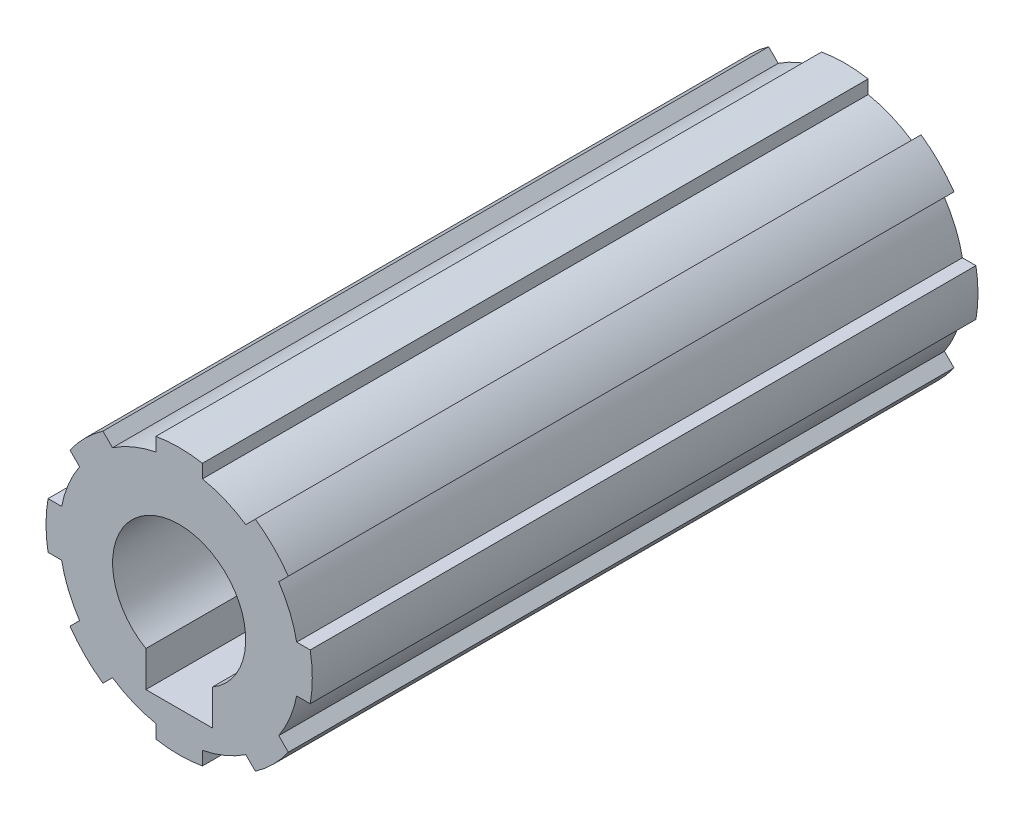
ISO-10303-21;
HEADER;
FILE_DESCRIPTION(('STEP AP214'),'2;1');
FILE_NAME('part.step','',(''),(''),'','','');
FILE_SCHEMA(('AUTOMOTIVE_DESIGN { 1 0 10303 214 1 1 1 1 }'));
ENDSEC;
DATA;
#1=APPLICATION_CONTEXT('core data for automotive mechanical design processes');
#2=APPLICATION_PROTOCOL_DEFINITION('international standard','automotive_design',2000,#1);
#3=PRODUCT_CONTEXT('',#1,'mechanical');
#4=PRODUCT('Part','Part','',(#3));
#5=PRODUCT_RELATED_PRODUCT_CATEGORY('part','',(#4));
#6=PRODUCT_DEFINITION_FORMATION('','',#4);
#7=PRODUCT_DEFINITION_CONTEXT('part definition',#1,'design');
#8=PRODUCT_DEFINITION('design','',#6,#7);
#9=PRODUCT_DEFINITION_SHAPE('','',#8);
#10=(LENGTH_UNIT() NAMED_UNIT(*) SI_UNIT(.MILLI.,.METRE.));
#11=(NAMED_UNIT(*) PLANE_ANGLE_UNIT() SI_UNIT($,.RADIAN.));
#12=(NAMED_UNIT(*) SI_UNIT($,.STERADIAN.) SOLID_ANGLE_UNIT());
#13=UNCERTAINTY_MEASURE_WITH_UNIT(LENGTH_MEASURE(1.E-05),#10,'distance_accuracy_value','');
#14=(GEOMETRIC_REPRESENTATION_CONTEXT(3) GLOBAL_UNCERTAINTY_ASSIGNED_CONTEXT((#13)) GLOBAL_UNIT_ASSIGNED_CONTEXT((#10,
#11,#12)) REPRESENTATION_CONTEXT('',''));
#15=CARTESIAN_POINT('',(0.,0.,0.));
#16=DIRECTION('',(0.,0.,1.));
#17=DIRECTION('',(1.,0.,0.));
#18=AXIS2_PLACEMENT_3D('',#15,#16,#17);
#19=CARTESIAN_POINT('',(0.,0.,50.));
#20=DIRECTION('',(0.,0.,-1.));
#21=DIRECTION('',(-1.,0.,0.));
#22=AXIS2_PLACEMENT_3D('',#19,#20,#21);
#23=CYLINDRICAL_SURFACE('',#22,18.);
#24=DIRECTION('',(0.,0.,-1.));
#25=VECTOR('',#24,1.);
#26=CARTESIAN_POINT('',(10.0101172550309,14.9598647233367,50.));
#27=LINE('',#26,#25);
#28=CARTESIAN_POINT('',(10.0101172550309,14.9598647233367,-50.));
#29=VERTEX_POINT('',#28);
#30=CARTESIAN_POINT('',(10.0101172550309,14.9598647233367,50.));
#31=VERTEX_POINT('',#30);
#32=EDGE_CURVE('E496',#29,#31,#27,.F.);
#33=ORIENTED_EDGE('',*,*,#32,.F.);
#34=CARTESIAN_POINT('',(0.,0.,-50.));
#35=DIRECTION('',(0.,0.,1.));
#36=DIRECTION('',(1.,0.,0.));
#37=AXIS2_PLACEMENT_3D('',#34,#35,#36);
#38=CIRCLE('',#37,18.);
#39=CARTESIAN_POINT('',(3.5,17.6564435830096,-50.));
#40=VERTEX_POINT('',#39);
#41=EDGE_CURVE('E525',#29,#40,#38,.T.);
#42=ORIENTED_EDGE('',*,*,#41,.T.);
#43=DIRECTION('',(0.,0.,-1.));
#44=VECTOR('',#43,1.);
#45=CARTESIAN_POINT('',(3.5,17.6564435830096,50.));
#46=LINE('',#45,#44);
#47=CARTESIAN_POINT('',(3.5,17.6564435830096,50.));
#48=VERTEX_POINT('',#47);
#49=EDGE_CURVE('E520',#48,#40,#46,.T.);
#50=ORIENTED_EDGE('',*,*,#49,.F.);
#51=CARTESIAN_POINT('',(0.,0.,50.));
#52=DIRECTION('',(0.,0.,1.));
#53=DIRECTION('',(1.,0.,0.));
#54=AXIS2_PLACEMENT_3D('',#51,#52,#53);
#55=CIRCLE('',#54,18.);
#56=EDGE_CURVE('E42',#31,#48,#55,.T.);
#57=ORIENTED_EDGE('',*,*,#56,.F.);
#58=EDGE_LOOP('',(#33,#42,#50,#57));
#59=FACE_BOUND('',#58,.T.);
#60=ADVANCED_FACE('F33',(#59),#23,.T.);
#61=DIRECTION('',(0.,0.,-1.));
#62=VECTOR('',#61,1.);
#63=CARTESIAN_POINT('',(14.9598647233367,10.0101172550308,50.));
#64=LINE('',#63,#62);
#65=CARTESIAN_POINT('',(14.9598647233367,10.0101172550308,50.));
#66=VERTEX_POINT('',#65);
#67=CARTESIAN_POINT('',(14.9598647233367,10.0101172550308,-50.));
#68=VERTEX_POINT('',#67);
#69=EDGE_CURVE('E493',#66,#68,#64,.T.);
#70=ORIENTED_EDGE('',*,*,#69,.F.);
#71=CARTESIAN_POINT('',(17.6564435830096,3.49999999999994,50.));
#72=VERTEX_POINT('',#71);
#73=EDGE_CURVE('E532',#72,#66,#55,.T.);
#74=ORIENTED_EDGE('',*,*,#73,.F.);
#75=DIRECTION('',(0.,0.,-1.));
#76=VECTOR('',#75,1.);
#77=CARTESIAN_POINT('',(17.6564435830096,3.49999999999994,50.));
#78=LINE('',#77,#76);
#79=CARTESIAN_POINT('',(17.6564435830096,3.49999999999994,-50.));
#80=VERTEX_POINT('',#79);
#81=EDGE_CURVE('E490',#80,#72,#78,.F.);
#82=ORIENTED_EDGE('',*,*,#81,.F.);
#83=EDGE_CURVE('E528',#80,#68,#38,.T.);
#84=ORIENTED_EDGE('',*,*,#83,.T.);
#85=EDGE_LOOP('',(#70,#74,#82,#84));
#86=FACE_BOUND('',#85,.T.);
#87=ADVANCED_FACE('F580',(#86),#23,.T.);
#88=DIRECTION('',(0.,0.,-1.));
#89=VECTOR('',#88,1.);
#90=CARTESIAN_POINT('',(-10.0101172550308,14.9598647233367,50.));
#91=LINE('',#90,#89);
#92=CARTESIAN_POINT('',(-10.0101172550308,14.9598647233367,50.));
#93=VERTEX_POINT('',#92);
#94=CARTESIAN_POINT('',(-10.0101172550308,14.9598647233367,-50.));
#95=VERTEX_POINT('',#94);
#96=EDGE_CURVE('E487',#93,#95,#91,.T.);
#97=ORIENTED_EDGE('',*,*,#96,.F.);
#98=CARTESIAN_POINT('',(-3.5,17.6564435830096,50.));
#99=VERTEX_POINT('',#98);
#100=EDGE_CURVE('E11',#99,#93,#55,.T.);
#101=ORIENTED_EDGE('',*,*,#100,.F.);
#102=DIRECTION('',(0.,0.,-1.));
#103=VECTOR('',#102,1.);
#104=CARTESIAN_POINT('',(-3.5,17.6564435830096,50.));
#105=LINE('',#104,#103);
#106=CARTESIAN_POINT('',(-3.5,17.6564435830096,-50.));
#107=VERTEX_POINT('',#106);
#108=EDGE_CURVE('E523',#107,#99,#105,.F.);
#109=ORIENTED_EDGE('',*,*,#108,.F.);
#110=EDGE_CURVE('E36',#107,#95,#38,.T.);
#111=ORIENTED_EDGE('',*,*,#110,.T.);
#112=EDGE_LOOP('',(#97,#101,#109,#111));
#113=FACE_BOUND('',#112,.T.);
#114=ADVANCED_FACE('F585',(#113),#23,.T.);
#115=DIRECTION('',(0.,0.,-1.));
#116=VECTOR('',#115,1.);
#117=CARTESIAN_POINT('',(17.6564435830096,-3.50000000000006,50.));
#118=LINE('',#117,#116);
#119=CARTESIAN_POINT('',(17.6564435830096,-3.50000000000006,50.));
#120=VERTEX_POINT('',#119);
#121=CARTESIAN_POINT('',(17.6564435830096,-3.50000000000006,-50.));
#122=VERTEX_POINT('',#121);
#123=EDGE_CURVE('E484',#120,#122,#118,.T.);
#124=ORIENTED_EDGE('',*,*,#123,.F.);
#125=CARTESIAN_POINT('',(14.9598647233366,-10.0101172550309,50.));
#126=VERTEX_POINT('',#125);
#127=EDGE_CURVE('E562',#126,#120,#55,.T.);
#128=ORIENTED_EDGE('',*,*,#127,.F.);
#129=DIRECTION('',(0.,0.,-1.));
#130=VECTOR('',#129,1.);
#131=CARTESIAN_POINT('',(14.9598647233366,-10.0101172550309,50.));
#132=LINE('',#131,#130);
#133=CARTESIAN_POINT('',(14.9598647233366,-10.0101172550309,-50.));
#134=VERTEX_POINT('',#133);
#135=EDGE_CURVE('E481',#134,#126,#132,.F.);
#136=ORIENTED_EDGE('',*,*,#135,.F.);
#137=EDGE_CURVE('E529',#134,#122,#38,.T.);
#138=ORIENTED_EDGE('',*,*,#137,.T.);
#139=EDGE_LOOP('',(#124,#128,#136,#138));
#140=FACE_BOUND('',#139,.T.);
#141=ADVANCED_FACE('F546',(#140),#23,.T.);
#142=DIRECTION('',(0.,0.,-1.));
#143=VECTOR('',#142,1.);
#144=CARTESIAN_POINT('',(10.0101172550308,-14.9598647233367,50.));
#145=LINE('',#144,#143);
#146=CARTESIAN_POINT('',(10.0101172550308,-14.9598647233367,50.));
#147=VERTEX_POINT('',#146);
#148=CARTESIAN_POINT('',(10.0101172550308,-14.9598647233367,-50.));
#149=VERTEX_POINT('',#148);
#150=EDGE_CURVE('E478',#147,#149,#145,.T.);
#151=ORIENTED_EDGE('',*,*,#150,.F.);
#152=CARTESIAN_POINT('',(3.49999999999988,-17.6564435830096,50.));
#153=VERTEX_POINT('',#152);
#154=EDGE_CURVE('E563',#153,#147,#55,.T.);
#155=ORIENTED_EDGE('',*,*,#154,.F.);
#156=DIRECTION('',(0.,0.,-1.));
#157=VECTOR('',#156,1.);
#158=CARTESIAN_POINT('',(3.49999999999988,-17.6564435830096,50.));
#159=LINE('',#158,#157);
#160=CARTESIAN_POINT('',(3.49999999999988,-17.6564435830096,-50.));
#161=VERTEX_POINT('',#160);
#162=EDGE_CURVE('E475',#161,#153,#159,.F.);
#163=ORIENTED_EDGE('',*,*,#162,.F.);
#164=EDGE_CURVE('E539',#161,#149,#38,.T.);
#165=ORIENTED_EDGE('',*,*,#164,.T.);
#166=EDGE_LOOP('',(#151,#155,#163,#165));
#167=FACE_BOUND('',#166,.T.);
#168=ADVANCED_FACE('F636',(#167),#23,.T.);
#169=DIRECTION('',(0.,0.,-1.));
#170=VECTOR('',#169,1.);
#171=CARTESIAN_POINT('',(-3.50000000000012,-17.6564435830096,50.));
#172=LINE('',#171,#170);
#173=CARTESIAN_POINT('',(-3.50000000000012,-17.6564435830096,50.));
#174=VERTEX_POINT('',#173);
#175=CARTESIAN_POINT('',(-3.50000000000012,-17.6564435830096,-50.));
#176=VERTEX_POINT('',#175);
#177=EDGE_CURVE('E472',#174,#176,#172,.T.);
#178=ORIENTED_EDGE('',*,*,#177,.F.);
#179=CARTESIAN_POINT('',(-10.010117255031,-14.9598647233366,50.));
#180=VERTEX_POINT('',#179);
#181=EDGE_CURVE('E565',#180,#174,#55,.T.);
#182=ORIENTED_EDGE('',*,*,#181,.F.);
#183=DIRECTION('',(0.,0.,-1.));
#184=VECTOR('',#183,1.);
#185=CARTESIAN_POINT('',(-10.010117255031,-14.9598647233366,50.));
#186=LINE('',#185,#184);
#187=CARTESIAN_POINT('',(-10.010117255031,-14.9598647233366,-50.));
#188=VERTEX_POINT('',#187);
#189=EDGE_CURVE('E469',#188,#180,#186,.F.);
#190=ORIENTED_EDGE('',*,*,#189,.F.);
#191=EDGE_CURVE('E536',#188,#176,#38,.T.);
#192=ORIENTED_EDGE('',*,*,#191,.T.);
#193=EDGE_LOOP('',(#178,#182,#190,#192));
#194=FACE_BOUND('',#193,.T.);
#195=ADVANCED_FACE('F594',(#194),#23,.T.);
#196=DIRECTION('',(0.,0.,-1.));
#197=VECTOR('',#196,1.);
#198=CARTESIAN_POINT('',(-14.9598647233368,-10.0101172550307,50.));
#199=LINE('',#198,#197);
#200=CARTESIAN_POINT('',(-14.9598647233368,-10.0101172550307,50.));
#201=VERTEX_POINT('',#200);
#202=CARTESIAN_POINT('',(-14.9598647233368,-10.0101172550307,-50.));
#203=VERTEX_POINT('',#202);
#204=EDGE_CURVE('E466',#201,#203,#199,.T.);
#205=ORIENTED_EDGE('',*,*,#204,.F.);
#206=CARTESIAN_POINT('',(-17.6564435830096,-3.49999999999982,50.));
#207=VERTEX_POINT('',#206);
#208=EDGE_CURVE('E600',#207,#201,#55,.T.);
#209=ORIENTED_EDGE('',*,*,#208,.F.);
#210=DIRECTION('',(0.,0.,-1.));
#211=VECTOR('',#210,1.);
#212=CARTESIAN_POINT('',(-17.6564435830096,-3.49999999999982,50.));
#213=LINE('',#212,#211);
#214=CARTESIAN_POINT('',(-17.6564435830096,-3.49999999999982,-50.));
#215=VERTEX_POINT('',#214);
#216=EDGE_CURVE('E463',#215,#207,#213,.F.);
#217=ORIENTED_EDGE('',*,*,#216,.F.);
#218=EDGE_CURVE('E533',#215,#203,#38,.T.);
#219=ORIENTED_EDGE('',*,*,#218,.T.);
#220=EDGE_LOOP('',(#205,#209,#217,#219));
#221=FACE_BOUND('',#220,.T.);
#222=ADVANCED_FACE('F587',(#221),#23,.T.);
#223=DIRECTION('',(0.,0.,-1.));
#224=VECTOR('',#223,1.);
#225=CARTESIAN_POINT('',(-17.6564435830095,3.50000000000019,50.));
#226=LINE('',#225,#224);
#227=CARTESIAN_POINT('',(-17.6564435830095,3.50000000000019,50.));
#228=VERTEX_POINT('',#227);
#229=CARTESIAN_POINT('',(-17.6564435830095,3.50000000000019,-50.));
#230=VERTEX_POINT('',#229);
#231=EDGE_CURVE('E460',#228,#230,#226,.T.);
#232=ORIENTED_EDGE('',*,*,#231,.F.);
#233=CARTESIAN_POINT('',(-14.9598647233366,10.010117255031,50.));
#234=VERTEX_POINT('',#233);
#235=EDGE_CURVE('E41',#234,#228,#55,.T.);
#236=ORIENTED_EDGE('',*,*,#235,.F.);
#237=DIRECTION('',(0.,0.,-1.));
#238=VECTOR('',#237,1.);
#239=CARTESIAN_POINT('',(-14.9598647233366,10.010117255031,50.));
#240=LINE('',#239,#238);
#241=CARTESIAN_POINT('',(-14.9598647233366,10.010117255031,-50.));
#242=VERTEX_POINT('',#241);
#243=EDGE_CURVE('E457',#242,#234,#240,.F.);
#244=ORIENTED_EDGE('',*,*,#243,.F.);
#245=EDGE_CURVE('E530',#242,#230,#38,.T.);
#246=ORIENTED_EDGE('',*,*,#245,.T.);
#247=EDGE_LOOP('',(#232,#236,#244,#246));
#248=FACE_BOUND('',#247,.T.);
#249=ADVANCED_FACE('F581',(#248),#23,.T.);
#250=CARTESIAN_POINT('',(0.,0.,50.));
#251=DIRECTION('',(0.,0.,1.));
#252=DIRECTION('',(1.,0.,0.));
#253=AXIS2_PLACEMENT_3D('',#250,#251,#252);
#254=PLANE('',#253);
#255=DIRECTION('',(0.,1.,0.));
#256=VECTOR('',#255,1.);
#257=CARTESIAN_POINT('',(-5.,-14.,50.));
#258=LINE('',#257,#256);
#259=CARTESIAN_POINT('',(-5.,-14.,50.));
#260=VERTEX_POINT('',#259);
#261=CARTESIAN_POINT('',(-5.,-8.66025403784439,50.));
#262=VERTEX_POINT('',#261);
#263=EDGE_CURVE('E298',#260,#262,#258,.T.);
#264=ORIENTED_EDGE('',*,*,#263,.T.);
#265=CARTESIAN_POINT('',(0.,0.,50.));
#266=DIRECTION('',(0.,0.,1.));
#267=DIRECTION('',(1.,0.,0.));
#268=AXIS2_PLACEMENT_3D('',#265,#266,#267);
#269=CIRCLE('',#268,10.);
#270=CARTESIAN_POINT('',(5.,-8.66025403784439,50.));
#271=VERTEX_POINT('',#270);
#272=EDGE_CURVE('E288',#271,#262,#269,.T.);
#273=ORIENTED_EDGE('',*,*,#272,.F.);
#274=DIRECTION('',(0.,1.,0.));
#275=VECTOR('',#274,1.);
#276=CARTESIAN_POINT('',(5.,-14.,50.));
#277=LINE('',#276,#275);
#278=CARTESIAN_POINT('',(5.,-14.,50.));
#279=VERTEX_POINT('',#278);
#280=EDGE_CURVE('E49',#279,#271,#277,.T.);
#281=ORIENTED_EDGE('',*,*,#280,.F.);
#282=DIRECTION('',(1.,0.,0.));
#283=VECTOR('',#282,1.);
#284=CARTESIAN_POINT('',(-5.,-14.,50.));
#285=LINE('',#284,#283);
#286=EDGE_CURVE('E267',#260,#279,#285,.T.);
#287=ORIENTED_EDGE('',*,*,#286,.F.);
#288=EDGE_LOOP('',(#264,#273,#281,#287));
#289=FACE_BOUND('',#288,.T.);
#290=ORIENTED_EDGE('',*,*,#73,.T.);
#291=DIRECTION('',(0.707106781186549,0.707106781186546,0.));
#292=VECTOR('',#291,1.);
#293=CARTESIAN_POINT('',(2.47487373415291,-2.47487373415292,50.));
#294=LINE('',#293,#292);
#295=CARTESIAN_POINT('',(16.3987740497973,11.4490265814914,50.));
#296=VERTEX_POINT('',#295);
#297=EDGE_CURVE('E443',#66,#296,#294,.T.);
#298=ORIENTED_EDGE('',*,*,#297,.T.);
#299=CARTESIAN_POINT('',(0.,0.,50.));
#300=DIRECTION('',(0.,0.,1.));
#301=DIRECTION('',(0.707106781186546,-0.707106781186549,0.));
#302=AXIS2_PLACEMENT_3D('',#299,#300,#301);
#303=CIRCLE('',#302,20.);
#304=CARTESIAN_POINT('',(11.4490265814914,16.3987740497972,50.));
#305=VERTEX_POINT('',#304);
#306=EDGE_CURVE('E436',#296,#305,#303,.T.);
#307=ORIENTED_EDGE('',*,*,#306,.T.);
#308=DIRECTION('',(-0.707106781186549,-0.707106781186546,0.));
#309=VECTOR('',#308,1.);
#310=CARTESIAN_POINT('',(11.4490265814914,16.3987740497972,50.));
#311=LINE('',#310,#309);
#312=EDGE_CURVE('E439',#305,#31,#311,.T.);
#313=ORIENTED_EDGE('',*,*,#312,.T.);
#314=ORIENTED_EDGE('',*,*,#56,.T.);
#315=DIRECTION('',(0.,1.,0.));
#316=VECTOR('',#315,1.);
#317=CARTESIAN_POINT('',(3.5,0.,50.));
#318=LINE('',#317,#316);
#319=CARTESIAN_POINT('',(3.5,19.6913686675152,50.));
#320=VERTEX_POINT('',#319);
#321=EDGE_CURVE('E506',#48,#320,#318,.T.);
#322=ORIENTED_EDGE('',*,*,#321,.T.);
#323=CARTESIAN_POINT('',(0.,0.,50.));
#324=DIRECTION('',(0.,0.,1.));
#325=DIRECTION('',(1.,0.,0.));
#326=AXIS2_PLACEMENT_3D('',#323,#324,#325);
#327=CIRCLE('',#326,20.);
#328=CARTESIAN_POINT('',(-3.5,19.6913686675152,50.));
#329=VERTEX_POINT('',#328);
#330=EDGE_CURVE('E499',#320,#329,#327,.T.);
#331=ORIENTED_EDGE('',*,*,#330,.T.);
#332=DIRECTION('',(0.,-1.,0.));
#333=VECTOR('',#332,1.);
#334=CARTESIAN_POINT('',(-3.5,19.6913686675152,50.));
#335=LINE('',#334,#333);
#336=EDGE_CURVE('E502',#329,#99,#335,.T.);
#337=ORIENTED_EDGE('',*,*,#336,.T.);
#338=ORIENTED_EDGE('',*,*,#100,.T.);
#339=DIRECTION('',(-0.707106781186544,0.707106781186551,0.));
#340=VECTOR('',#339,1.);
#341=CARTESIAN_POINT('',(16.3987740497972,-11.4490265814915,50.));
#342=LINE('',#341,#340);
#343=CARTESIAN_POINT('',(-11.4490265814912,16.3987740497974,50.));
#344=VERTEX_POINT('',#343);
#345=EDGE_CURVE('E393',#93,#344,#342,.T.);
#346=ORIENTED_EDGE('',*,*,#345,.T.);
#347=CARTESIAN_POINT('',(0.,0.,50.));
#348=DIRECTION('',(0.,0.,1.));
#349=DIRECTION('',(0.707106781186556,0.707106781186539,0.));
#350=AXIS2_PLACEMENT_3D('',#347,#348,#349);
#351=CIRCLE('',#350,20.);
#352=CARTESIAN_POINT('',(-16.3987740497971,11.4490265814916,50.));
#353=VERTEX_POINT('',#352);
#354=EDGE_CURVE('E306',#344,#353,#351,.T.);
#355=ORIENTED_EDGE('',*,*,#354,.T.);
#356=DIRECTION('',(0.707106781186539,-0.707106781186556,0.));
#357=VECTOR('',#356,1.);
#358=CARTESIAN_POINT('',(-16.3987740497971,11.4490265814916,50.));
#359=LINE('',#358,#357);
#360=EDGE_CURVE('E309',#353,#234,#359,.T.);
#361=ORIENTED_EDGE('',*,*,#360,.T.);
#362=ORIENTED_EDGE('',*,*,#235,.T.);
#363=DIRECTION('',(-1.,0.,0.));
#364=VECTOR('',#363,1.);
#365=CARTESIAN_POINT('',(0.,3.5,50.));
#366=LINE('',#365,#364);
#367=CARTESIAN_POINT('',(-19.6913686675152,3.50000000000021,50.));
#368=VERTEX_POINT('',#367);
#369=EDGE_CURVE('E331',#228,#368,#366,.T.);
#370=ORIENTED_EDGE('',*,*,#369,.T.);
#371=CARTESIAN_POINT('',(0.,0.,50.));
#372=DIRECTION('',(0.,0.,1.));
#373=DIRECTION('',(0.,1.,0.));
#374=AXIS2_PLACEMENT_3D('',#371,#372,#373);
#375=CIRCLE('',#374,20.);
#376=CARTESIAN_POINT('',(-19.6913686675153,-3.49999999999979,50.));
#377=VERTEX_POINT('',#376);
#378=EDGE_CURVE('E324',#368,#377,#375,.T.);
#379=ORIENTED_EDGE('',*,*,#378,.T.);
#380=DIRECTION('',(1.,0.,0.));
#381=VECTOR('',#380,1.);
#382=CARTESIAN_POINT('',(-19.6913686675153,-3.49999999999979,50.));
#383=LINE('',#382,#381);
#384=EDGE_CURVE('E327',#377,#207,#383,.T.);
#385=ORIENTED_EDGE('',*,*,#384,.T.);
#386=ORIENTED_EDGE('',*,*,#208,.T.);
#387=DIRECTION('',(-0.707106781186554,-0.707106781186541,0.));
#388=VECTOR('',#387,1.);
#389=CARTESIAN_POINT('',(-2.4748737341529,2.47487373415294,50.));
#390=LINE('',#389,#388);
#391=CARTESIAN_POINT('',(-16.3987740497973,-11.4490265814913,50.));
#392=VERTEX_POINT('',#391);
#393=EDGE_CURVE('E353',#201,#392,#390,.T.);
#394=ORIENTED_EDGE('',*,*,#393,.T.);
#395=CARTESIAN_POINT('',(0.,0.,50.));
#396=DIRECTION('',(0.,0.,1.));
#397=DIRECTION('',(-0.707106781186541,0.707106781186554,0.));
#398=AXIS2_PLACEMENT_3D('',#395,#396,#397);
#399=CIRCLE('',#398,20.);
#400=CARTESIAN_POINT('',(-11.4490265814915,-16.3987740497971,50.));
#401=VERTEX_POINT('',#400);
#402=EDGE_CURVE('E346',#392,#401,#399,.T.);
#403=ORIENTED_EDGE('',*,*,#402,.T.);
#404=DIRECTION('',(0.707106781186554,0.707106781186541,0.));
#405=VECTOR('',#404,1.);
#406=CARTESIAN_POINT('',(-11.4490265814915,-16.3987740497971,50.));
#407=LINE('',#406,#405);
#408=EDGE_CURVE('E349',#401,#180,#407,.T.);
#409=ORIENTED_EDGE('',*,*,#408,.T.);
#410=ORIENTED_EDGE('',*,*,#181,.T.);
#411=DIRECTION('',(0.,-1.,0.));
#412=VECTOR('',#411,1.);
#413=CARTESIAN_POINT('',(-3.5,0.,50.));
#414=LINE('',#413,#412);
#415=CARTESIAN_POINT('',(-3.50000000000014,-19.6913686675152,50.));
#416=VERTEX_POINT('',#415);
#417=EDGE_CURVE('E375',#174,#416,#414,.T.);
#418=ORIENTED_EDGE('',*,*,#417,.T.);
#419=CARTESIAN_POINT('',(0.,0.,50.));
#420=DIRECTION('',(0.,0.,1.));
#421=DIRECTION('',(-1.,0.,0.));
#422=AXIS2_PLACEMENT_3D('',#419,#420,#421);
#423=CIRCLE('',#422,20.);
#424=CARTESIAN_POINT('',(3.49999999999986,-19.6913686675152,50.));
#425=VERTEX_POINT('',#424);
#426=EDGE_CURVE('E368',#416,#425,#423,.T.);
#427=ORIENTED_EDGE('',*,*,#426,.T.);
#428=DIRECTION('',(0.,1.,0.));
#429=VECTOR('',#428,1.);
#430=CARTESIAN_POINT('',(3.49999999999986,-19.6913686675152,50.));
#431=LINE('',#430,#429);
#432=EDGE_CURVE('E371',#425,#153,#431,.T.);
#433=ORIENTED_EDGE('',*,*,#432,.T.);
#434=ORIENTED_EDGE('',*,*,#154,.T.);
#435=DIRECTION('',(0.707106781186544,-0.707106781186551,0.));
#436=VECTOR('',#435,1.);
#437=CARTESIAN_POINT('',(-2.47487373415293,-2.4748737341529,50.));
#438=LINE('',#437,#436);
#439=CARTESIAN_POINT('',(11.4490265814913,-16.3987740497973,50.));
#440=VERTEX_POINT('',#439);
#441=EDGE_CURVE('E398',#147,#440,#438,.T.);
#442=ORIENTED_EDGE('',*,*,#441,.T.);
#443=CARTESIAN_POINT('',(0.,0.,50.));
#444=DIRECTION('',(0.,0.,1.));
#445=DIRECTION('',(-0.707106781186551,-0.707106781186544,0.));
#446=AXIS2_PLACEMENT_3D('',#443,#444,#445);
#447=CIRCLE('',#446,20.);
#448=CARTESIAN_POINT('',(16.3987740497972,-11.4490265814915,50.));
#449=VERTEX_POINT('',#448);
#450=EDGE_CURVE('E390',#440,#449,#447,.T.);
#451=ORIENTED_EDGE('',*,*,#450,.T.);
#452=EDGE_CURVE('E395',#449,#126,#342,.T.);
#453=ORIENTED_EDGE('',*,*,#452,.T.);
#454=ORIENTED_EDGE('',*,*,#127,.T.);
#455=DIRECTION('',(1.,0.,0.));
#456=VECTOR('',#455,1.);
#457=CARTESIAN_POINT('',(0.,-3.5,50.));
#458=LINE('',#457,#456);
#459=CARTESIAN_POINT('',(19.6913686675152,-3.50000000000007,50.));
#460=VERTEX_POINT('',#459);
#461=EDGE_CURVE('E421',#120,#460,#458,.T.);
#462=ORIENTED_EDGE('',*,*,#461,.T.);
#463=CARTESIAN_POINT('',(0.,0.,50.));
#464=DIRECTION('',(0.,0.,1.));
#465=DIRECTION('',(0.,-1.,0.));
#466=AXIS2_PLACEMENT_3D('',#463,#464,#465);
#467=CIRCLE('',#466,20.);
#468=CARTESIAN_POINT('',(19.6913686675152,3.49999999999993,50.));
#469=VERTEX_POINT('',#468);
#470=EDGE_CURVE('E414',#460,#469,#467,.T.);
#471=ORIENTED_EDGE('',*,*,#470,.T.);
#472=DIRECTION('',(-1.,0.,0.));
#473=VECTOR('',#472,1.);
#474=CARTESIAN_POINT('',(19.6913686675152,3.49999999999993,50.));
#475=LINE('',#474,#473);
#476=EDGE_CURVE('E417',#469,#72,#475,.T.);
#477=ORIENTED_EDGE('',*,*,#476,.T.);
#478=EDGE_LOOP('',(#290,#298,#307,#313,#314,#322,#331,#337,#338,#346,#355,#361,#362,#370,#379,
#385,#386,#394,#403,#409,#410,#418,#427,#433,#434,#442,#451,#453,#454,#462,#471,#477));
#479=FACE_BOUND('',#478,.T.);
#480=ADVANCED_FACE('F285',(#289,#479),#254,.T.);
#481=CARTESIAN_POINT('',(0.,0.,-50.));
#482=DIRECTION('',(0.,0.,1.));
#483=DIRECTION('',(1.,0.,0.));
#484=AXIS2_PLACEMENT_3D('',#481,#482,#483);
#485=PLANE('',#484);
#486=ORIENTED_EDGE('',*,*,#41,.F.);
#487=DIRECTION('',(-0.707106781186549,-0.707106781186546,0.));
#488=VECTOR('',#487,1.);
#489=CARTESIAN_POINT('',(11.4490265814914,16.3987740497972,-50.));
#490=LINE('',#489,#488);
#491=CARTESIAN_POINT('',(11.4490265814914,16.3987740497972,-50.));
#492=VERTEX_POINT('',#491);
#493=EDGE_CURVE('E448',#492,#29,#490,.T.);
#494=ORIENTED_EDGE('',*,*,#493,.F.);
#495=CARTESIAN_POINT('',(0.,0.,-50.));
#496=DIRECTION('',(0.,0.,1.));
#497=DIRECTION('',(0.707106781186546,-0.707106781186549,0.));
#498=AXIS2_PLACEMENT_3D('',#495,#496,#497);
#499=CIRCLE('',#498,20.);
#500=CARTESIAN_POINT('',(16.3987740497973,11.4490265814914,-50.));
#501=VERTEX_POINT('',#500);
#502=EDGE_CURVE('E435',#501,#492,#499,.T.);
#503=ORIENTED_EDGE('',*,*,#502,.F.);
#504=DIRECTION('',(0.707106781186549,0.707106781186546,0.));
#505=VECTOR('',#504,1.);
#506=CARTESIAN_POINT('',(2.47487373415291,-2.47487373415292,-50.));
#507=LINE('',#506,#505);
#508=EDGE_CURVE('E440',#68,#501,#507,.T.);
#509=ORIENTED_EDGE('',*,*,#508,.F.);
#510=ORIENTED_EDGE('',*,*,#83,.F.);
#511=DIRECTION('',(-1.,0.,0.));
#512=VECTOR('',#511,1.);
#513=CARTESIAN_POINT('',(19.6913686675152,3.49999999999993,-50.));
#514=LINE('',#513,#512);
#515=CARTESIAN_POINT('',(19.6913686675152,3.49999999999993,-50.));
#516=VERTEX_POINT('',#515);
#517=EDGE_CURVE('E426',#516,#80,#514,.T.);
#518=ORIENTED_EDGE('',*,*,#517,.F.);
#519=CARTESIAN_POINT('',(0.,0.,-50.));
#520=DIRECTION('',(0.,0.,1.));
#521=DIRECTION('',(0.,-1.,0.));
#522=AXIS2_PLACEMENT_3D('',#519,#520,#521);
#523=CIRCLE('',#522,20.);
#524=CARTESIAN_POINT('',(19.6913686675152,-3.50000000000007,-50.));
#525=VERTEX_POINT('',#524);
#526=EDGE_CURVE('E413',#525,#516,#523,.T.);
#527=ORIENTED_EDGE('',*,*,#526,.F.);
#528=DIRECTION('',(1.,0.,0.));
#529=VECTOR('',#528,1.);
#530=CARTESIAN_POINT('',(0.,-3.5,-50.));
#531=LINE('',#530,#529);
#532=EDGE_CURVE('E418',#122,#525,#531,.T.);
#533=ORIENTED_EDGE('',*,*,#532,.F.);
#534=ORIENTED_EDGE('',*,*,#137,.F.);
#535=DIRECTION('',(-0.707106781186544,0.707106781186551,0.));
#536=VECTOR('',#535,1.);
#537=CARTESIAN_POINT('',(16.3987740497972,-11.4490265814915,-50.));
#538=LINE('',#537,#536);
#539=CARTESIAN_POINT('',(16.3987740497972,-11.4490265814915,-50.));
#540=VERTEX_POINT('',#539);
#541=EDGE_CURVE('E404',#540,#134,#538,.T.);
#542=ORIENTED_EDGE('',*,*,#541,.F.);
#543=CARTESIAN_POINT('',(0.,0.,-50.));
#544=DIRECTION('',(0.,0.,1.));
#545=DIRECTION('',(-0.707106781186551,-0.707106781186544,0.));
#546=AXIS2_PLACEMENT_3D('',#543,#544,#545);
#547=CIRCLE('',#546,20.);
#548=CARTESIAN_POINT('',(11.4490265814913,-16.3987740497973,-50.));
#549=VERTEX_POINT('',#548);
#550=EDGE_CURVE('E389',#549,#540,#547,.T.);
#551=ORIENTED_EDGE('',*,*,#550,.F.);
#552=DIRECTION('',(0.707106781186544,-0.707106781186551,0.));
#553=VECTOR('',#552,1.);
#554=CARTESIAN_POINT('',(-2.47487373415293,-2.4748737341529,-50.));
#555=LINE('',#554,#553);
#556=EDGE_CURVE('E394',#149,#549,#555,.T.);
#557=ORIENTED_EDGE('',*,*,#556,.F.);
#558=ORIENTED_EDGE('',*,*,#164,.F.);
#559=DIRECTION('',(0.,1.,0.));
#560=VECTOR('',#559,1.);
#561=CARTESIAN_POINT('',(3.49999999999986,-19.6913686675152,-50.));
#562=LINE('',#561,#560);
#563=CARTESIAN_POINT('',(3.49999999999986,-19.6913686675152,-50.));
#564=VERTEX_POINT('',#563);
#565=EDGE_CURVE('E380',#564,#161,#562,.T.);
#566=ORIENTED_EDGE('',*,*,#565,.F.);
#567=CARTESIAN_POINT('',(0.,0.,-50.));
#568=DIRECTION('',(0.,0.,1.));
#569=DIRECTION('',(-1.,0.,0.));
#570=AXIS2_PLACEMENT_3D('',#567,#568,#569);
#571=CIRCLE('',#570,20.);
#572=CARTESIAN_POINT('',(-3.50000000000014,-19.6913686675152,-50.));
#573=VERTEX_POINT('',#572);
#574=EDGE_CURVE('E367',#573,#564,#571,.T.);
#575=ORIENTED_EDGE('',*,*,#574,.F.);
#576=DIRECTION('',(0.,-1.,0.));
#577=VECTOR('',#576,1.);
#578=CARTESIAN_POINT('',(-3.5,0.,-50.));
#579=LINE('',#578,#577);
#580=EDGE_CURVE('E372',#176,#573,#579,.T.);
#581=ORIENTED_EDGE('',*,*,#580,.F.);
#582=ORIENTED_EDGE('',*,*,#191,.F.);
#583=DIRECTION('',(0.707106781186554,0.707106781186541,0.));
#584=VECTOR('',#583,1.);
#585=CARTESIAN_POINT('',(-11.4490265814915,-16.3987740497971,-50.));
#586=LINE('',#585,#584);
#587=CARTESIAN_POINT('',(-11.4490265814915,-16.3987740497971,-50.));
#588=VERTEX_POINT('',#587);
#589=EDGE_CURVE('E358',#588,#188,#586,.T.);
#590=ORIENTED_EDGE('',*,*,#589,.F.);
#591=CARTESIAN_POINT('',(0.,0.,-50.));
#592=DIRECTION('',(0.,0.,1.));
#593=DIRECTION('',(-0.707106781186541,0.707106781186554,0.));
#594=AXIS2_PLACEMENT_3D('',#591,#592,#593);
#595=CIRCLE('',#594,20.);
#596=CARTESIAN_POINT('',(-16.3987740497973,-11.4490265814913,-50.));
#597=VERTEX_POINT('',#596);
#598=EDGE_CURVE('E345',#597,#588,#595,.T.);
#599=ORIENTED_EDGE('',*,*,#598,.F.);
#600=DIRECTION('',(-0.707106781186554,-0.707106781186541,0.));
#601=VECTOR('',#600,1.);
#602=CARTESIAN_POINT('',(-2.4748737341529,2.47487373415294,-50.));
#603=LINE('',#602,#601);
#604=EDGE_CURVE('E350',#203,#597,#603,.T.);
#605=ORIENTED_EDGE('',*,*,#604,.F.);
#606=ORIENTED_EDGE('',*,*,#218,.F.);
#607=DIRECTION('',(1.,0.,0.));
#608=VECTOR('',#607,1.);
#609=CARTESIAN_POINT('',(-19.6913686675153,-3.49999999999979,-50.));
#610=LINE('',#609,#608);
#611=CARTESIAN_POINT('',(-19.6913686675153,-3.49999999999979,-50.));
#612=VERTEX_POINT('',#611);
#613=EDGE_CURVE('E336',#612,#215,#610,.T.);
#614=ORIENTED_EDGE('',*,*,#613,.F.);
#615=CARTESIAN_POINT('',(0.,0.,-50.));
#616=DIRECTION('',(0.,0.,1.));
#617=DIRECTION('',(0.,1.,0.));
#618=AXIS2_PLACEMENT_3D('',#615,#616,#617);
#619=CIRCLE('',#618,20.);
#620=CARTESIAN_POINT('',(-19.6913686675152,3.50000000000021,-50.));
#621=VERTEX_POINT('',#620);
#622=EDGE_CURVE('E323',#621,#612,#619,.T.);
#623=ORIENTED_EDGE('',*,*,#622,.F.);
#624=DIRECTION('',(-1.,0.,0.));
#625=VECTOR('',#624,1.);
#626=CARTESIAN_POINT('',(0.,3.5,-50.));
#627=LINE('',#626,#625);
#628=EDGE_CURVE('E328',#230,#621,#627,.T.);
#629=ORIENTED_EDGE('',*,*,#628,.F.);
#630=ORIENTED_EDGE('',*,*,#245,.F.);
#631=DIRECTION('',(0.707106781186539,-0.707106781186556,0.));
#632=VECTOR('',#631,1.);
#633=CARTESIAN_POINT('',(-16.3987740497971,11.4490265814916,-50.));
#634=LINE('',#633,#632);
#635=CARTESIAN_POINT('',(-16.3987740497971,11.4490265814916,-50.));
#636=VERTEX_POINT('',#635);
#637=EDGE_CURVE('E310',#636,#242,#634,.T.);
#638=ORIENTED_EDGE('',*,*,#637,.F.);
#639=CARTESIAN_POINT('',(0.,0.,-50.));
#640=DIRECTION('',(0.,0.,1.));
#641=DIRECTION('',(0.707106781186556,0.707106781186539,0.));
#642=AXIS2_PLACEMENT_3D('',#639,#640,#641);
#643=CIRCLE('',#642,20.);
#644=CARTESIAN_POINT('',(-11.4490265814912,16.3987740497974,-50.));
#645=VERTEX_POINT('',#644);
#646=EDGE_CURVE('E304',#645,#636,#643,.T.);
#647=ORIENTED_EDGE('',*,*,#646,.F.);
#648=EDGE_CURVE('E403',#95,#645,#538,.T.);
#649=ORIENTED_EDGE('',*,*,#648,.F.);
#650=ORIENTED_EDGE('',*,*,#110,.F.);
#651=DIRECTION('',(0.,-1.,0.));
#652=VECTOR('',#651,1.);
#653=CARTESIAN_POINT('',(-3.5,19.6913686675152,-50.));
#654=LINE('',#653,#652);
#655=CARTESIAN_POINT('',(-3.5,19.6913686675152,-50.));
#656=VERTEX_POINT('',#655);
#657=EDGE_CURVE('E511',#656,#107,#654,.T.);
#658=ORIENTED_EDGE('',*,*,#657,.F.);
#659=CARTESIAN_POINT('',(0.,0.,-50.));
#660=DIRECTION('',(0.,0.,1.));
#661=DIRECTION('',(1.,0.,0.));
#662=AXIS2_PLACEMENT_3D('',#659,#660,#661);
#663=CIRCLE('',#662,20.);
#664=CARTESIAN_POINT('',(3.5,19.6913686675152,-50.));
#665=VERTEX_POINT('',#664);
#666=EDGE_CURVE('E498',#665,#656,#663,.T.);
#667=ORIENTED_EDGE('',*,*,#666,.F.);
#668=DIRECTION('',(0.,1.,0.));
#669=VECTOR('',#668,1.);
#670=CARTESIAN_POINT('',(3.5,0.,-50.));
#671=LINE('',#670,#669);
#672=EDGE_CURVE('E503',#40,#665,#671,.T.);
#673=ORIENTED_EDGE('',*,*,#672,.F.);
#674=EDGE_LOOP('',(#486,#494,#503,#509,#510,#518,#527,#533,#534,#542,#551,#557,#558,#566,#575,
#581,#582,#590,#599,#605,#606,#614,#623,#629,#630,#638,#647,#649,#650,#658,#667,#673));
#675=FACE_BOUND('',#674,.T.);
#676=ADVANCED_FACE('F555',(#675),#485,.F.);
#677=CARTESIAN_POINT('',(-3.5,19.6913686675152,50.));
#678=DIRECTION('',(1.,0.,0.));
#679=DIRECTION('',(0.,1.,0.));
#680=AXIS2_PLACEMENT_3D('',#677,#678,#679);
#681=PLANE('',#680);
#682=ORIENTED_EDGE('',*,*,#657,.T.);
#683=ORIENTED_EDGE('',*,*,#108,.T.);
#684=ORIENTED_EDGE('',*,*,#336,.F.);
#685=DIRECTION('',(0.,0.,-1.));
#686=VECTOR('',#685,1.);
#687=CARTESIAN_POINT('',(-3.5,19.6913686675152,50.));
#688=LINE('',#687,#686);
#689=EDGE_CURVE('E517',#329,#656,#688,.T.);
#690=ORIENTED_EDGE('',*,*,#689,.T.);
#691=EDGE_LOOP('',(#682,#683,#684,#690));
#692=FACE_BOUND('',#691,.T.);
#693=ADVANCED_FACE('F673',(#692),#681,.F.);
#694=CARTESIAN_POINT('',(3.5,0.,50.));
#695=DIRECTION('',(-1.,0.,0.));
#696=DIRECTION('',(0.,0.,1.));
#697=AXIS2_PLACEMENT_3D('',#694,#695,#696);
#698=PLANE('',#697);
#699=ORIENTED_EDGE('',*,*,#321,.F.);
#700=ORIENTED_EDGE('',*,*,#49,.T.);
#701=ORIENTED_EDGE('',*,*,#672,.T.);
#702=DIRECTION('',(0.,0.,-1.));
#703=VECTOR('',#702,1.);
#704=CARTESIAN_POINT('',(3.5,19.6913686675152,50.));
#705=LINE('',#704,#703);
#706=EDGE_CURVE('E508',#320,#665,#705,.T.);
#707=ORIENTED_EDGE('',*,*,#706,.F.);
#708=EDGE_LOOP('',(#699,#700,#701,#707));
#709=FACE_BOUND('',#708,.T.);
#710=ADVANCED_FACE('F685',(#709),#698,.F.);
#711=CARTESIAN_POINT('',(0.,0.,50.));
#712=DIRECTION('',(0.,0.,-1.));
#713=DIRECTION('',(-1.,0.,0.));
#714=AXIS2_PLACEMENT_3D('',#711,#712,#713);
#715=CYLINDRICAL_SURFACE('',#714,20.);
#716=ORIENTED_EDGE('',*,*,#666,.T.);
#717=ORIENTED_EDGE('',*,*,#689,.F.);
#718=ORIENTED_EDGE('',*,*,#330,.F.);
#719=ORIENTED_EDGE('',*,*,#706,.T.);
#720=EDGE_LOOP('',(#716,#717,#718,#719));
#721=FACE_BOUND('',#720,.T.);
#722=ADVANCED_FACE('F680',(#721),#715,.T.);
#723=CARTESIAN_POINT('',(0.,0.,50.));
#724=DIRECTION('',(0.,0.,-1.));
#725=DIRECTION('',(-1.,0.,0.));
#726=AXIS2_PLACEMENT_3D('',#723,#724,#725);
#727=CYLINDRICAL_SURFACE('',#726,20.);
#728=ORIENTED_EDGE('',*,*,#646,.T.);
#729=DIRECTION('',(0.,0.,-1.));
#730=VECTOR('',#729,1.);
#731=CARTESIAN_POINT('',(-16.3987740497971,11.4490265814916,50.));
#732=LINE('',#731,#730);
#733=EDGE_CURVE('E320',#353,#636,#732,.T.);
#734=ORIENTED_EDGE('',*,*,#733,.F.);
#735=ORIENTED_EDGE('',*,*,#354,.F.);
#736=DIRECTION('',(0.,0.,-1.));
#737=VECTOR('',#736,1.);
#738=CARTESIAN_POINT('',(-11.4490265814912,16.3987740497974,50.));
#739=LINE('',#738,#737);
#740=EDGE_CURVE('E313',#344,#645,#739,.T.);
#741=ORIENTED_EDGE('',*,*,#740,.T.);
#742=EDGE_LOOP('',(#728,#734,#735,#741));
#743=FACE_BOUND('',#742,.T.);
#744=ADVANCED_FACE('F665',(#743),#727,.T.);
#745=CARTESIAN_POINT('',(-16.3987740497971,11.4490265814916,50.));
#746=DIRECTION('',(0.707106781186556,0.707106781186539,0.));
#747=DIRECTION('',(-0.707106781186539,0.707106781186556,0.));
#748=AXIS2_PLACEMENT_3D('',#745,#746,#747);
#749=PLANE('',#748);
#750=ORIENTED_EDGE('',*,*,#637,.T.);
#751=ORIENTED_EDGE('',*,*,#243,.T.);
#752=ORIENTED_EDGE('',*,*,#360,.F.);
#753=ORIENTED_EDGE('',*,*,#733,.T.);
#754=EDGE_LOOP('',(#750,#751,#752,#753));
#755=FACE_BOUND('',#754,.T.);
#756=ADVANCED_FACE('F658',(#755),#749,.F.);
#757=CARTESIAN_POINT('',(16.3987740497972,-11.4490265814915,50.));
#758=DIRECTION('',(-0.707106781186551,-0.707106781186544,0.));
#759=DIRECTION('',(0.707106781186544,-0.707106781186551,0.));
#760=AXIS2_PLACEMENT_3D('',#757,#758,#759);
#761=PLANE('',#760);
#762=ORIENTED_EDGE('',*,*,#345,.F.);
#763=ORIENTED_EDGE('',*,*,#96,.T.);
#764=ORIENTED_EDGE('',*,*,#648,.T.);
#765=ORIENTED_EDGE('',*,*,#740,.F.);
#766=EDGE_LOOP('',(#762,#763,#764,#765));
#767=FACE_BOUND('',#766,.T.);
#768=ADVANCED_FACE('F650',(#767),#761,.F.);
#769=CARTESIAN_POINT('',(0.,0.,50.));
#770=DIRECTION('',(0.,0.,-1.));
#771=DIRECTION('',(-1.,0.,0.));
#772=AXIS2_PLACEMENT_3D('',#769,#770,#771);
#773=CYLINDRICAL_SURFACE('',#772,20.);
#774=ORIENTED_EDGE('',*,*,#622,.T.);
#775=DIRECTION('',(0.,0.,-1.));
#776=VECTOR('',#775,1.);
#777=CARTESIAN_POINT('',(-19.6913686675153,-3.49999999999979,50.));
#778=LINE('',#777,#776);
#779=EDGE_CURVE('E342',#377,#612,#778,.T.);
#780=ORIENTED_EDGE('',*,*,#779,.F.);
#781=ORIENTED_EDGE('',*,*,#378,.F.);
#782=DIRECTION('',(0.,0.,-1.));
#783=VECTOR('',#782,1.);
#784=CARTESIAN_POINT('',(-19.6913686675152,3.50000000000021,50.));
#785=LINE('',#784,#783);
#786=EDGE_CURVE('E333',#368,#621,#785,.T.);
#787=ORIENTED_EDGE('',*,*,#786,.T.);
#788=EDGE_LOOP('',(#774,#780,#781,#787));
#789=FACE_BOUND('',#788,.T.);
#790=ADVANCED_FACE('F606',(#789),#773,.T.);
#791=CARTESIAN_POINT('',(-19.6913686675153,-3.49999999999979,50.));
#792=DIRECTION('',(0.,1.,0.));
#793=DIRECTION('',(-1.,0.,0.));
#794=AXIS2_PLACEMENT_3D('',#791,#792,#793);
#795=PLANE('',#794);
#796=ORIENTED_EDGE('',*,*,#613,.T.);
#797=ORIENTED_EDGE('',*,*,#216,.T.);
#798=ORIENTED_EDGE('',*,*,#384,.F.);
#799=ORIENTED_EDGE('',*,*,#779,.T.);
#800=EDGE_LOOP('',(#796,#797,#798,#799));
#801=FACE_BOUND('',#800,.T.);
#802=ADVANCED_FACE('F610',(#801),#795,.F.);
#803=CARTESIAN_POINT('',(0.,3.5,50.));
#804=DIRECTION('',(0.,-1.,0.));
#805=DIRECTION('',(1.,0.,0.));
#806=AXIS2_PLACEMENT_3D('',#803,#804,#805);
#807=PLANE('',#806);
#808=ORIENTED_EDGE('',*,*,#369,.F.);
#809=ORIENTED_EDGE('',*,*,#231,.T.);
#810=ORIENTED_EDGE('',*,*,#628,.T.);
#811=ORIENTED_EDGE('',*,*,#786,.F.);
#812=EDGE_LOOP('',(#808,#809,#810,#811));
#813=FACE_BOUND('',#812,.T.);
#814=ADVANCED_FACE('F601',(#813),#807,.F.);
#815=CARTESIAN_POINT('',(0.,0.,50.));
#816=DIRECTION('',(0.,0.,-1.));
#817=DIRECTION('',(-1.,0.,0.));
#818=AXIS2_PLACEMENT_3D('',#815,#816,#817);
#819=CYLINDRICAL_SURFACE('',#818,20.);
#820=ORIENTED_EDGE('',*,*,#598,.T.);
#821=DIRECTION('',(0.,0.,-1.));
#822=VECTOR('',#821,1.);
#823=CARTESIAN_POINT('',(-11.4490265814915,-16.3987740497971,50.));
#824=LINE('',#823,#822);
#825=EDGE_CURVE('E364',#401,#588,#824,.T.);
#826=ORIENTED_EDGE('',*,*,#825,.F.);
#827=ORIENTED_EDGE('',*,*,#402,.F.);
#828=DIRECTION('',(0.,0.,-1.));
#829=VECTOR('',#828,1.);
#830=CARTESIAN_POINT('',(-16.3987740497973,-11.4490265814913,50.));
#831=LINE('',#830,#829);
#832=EDGE_CURVE('E355',#392,#597,#831,.T.);
#833=ORIENTED_EDGE('',*,*,#832,.T.);
#834=EDGE_LOOP('',(#820,#826,#827,#833));
#835=FACE_BOUND('',#834,.T.);
#836=ADVANCED_FACE('F618',(#835),#819,.T.);
#837=CARTESIAN_POINT('',(-11.4490265814915,-16.3987740497971,50.));
#838=DIRECTION('',(-0.707106781186542,0.707106781186554,0.));
#839=DIRECTION('',(-0.707106781186554,-0.707106781186542,0.));
#840=AXIS2_PLACEMENT_3D('',#837,#838,#839);
#841=PLANE('',#840);
#842=ORIENTED_EDGE('',*,*,#589,.T.);
#843=ORIENTED_EDGE('',*,*,#189,.T.);
#844=ORIENTED_EDGE('',*,*,#408,.F.);
#845=ORIENTED_EDGE('',*,*,#825,.T.);
#846=EDGE_LOOP('',(#842,#843,#844,#845));
#847=FACE_BOUND('',#846,.T.);
#848=ADVANCED_FACE('F623',(#847),#841,.F.);
#849=CARTESIAN_POINT('',(-2.4748737341529,2.47487373415294,50.));
#850=DIRECTION('',(0.707106781186541,-0.707106781186554,0.));
#851=DIRECTION('',(0.707106781186554,0.707106781186541,0.));
#852=AXIS2_PLACEMENT_3D('',#849,#850,#851);
#853=PLANE('',#852);
#854=ORIENTED_EDGE('',*,*,#393,.F.);
#855=ORIENTED_EDGE('',*,*,#204,.T.);
#856=ORIENTED_EDGE('',*,*,#604,.T.);
#857=ORIENTED_EDGE('',*,*,#832,.F.);
#858=EDGE_LOOP('',(#854,#855,#856,#857));
#859=FACE_BOUND('',#858,.T.);
#860=ADVANCED_FACE('F615',(#859),#853,.F.);
#861=CARTESIAN_POINT('',(0.,0.,50.));
#862=DIRECTION('',(0.,0.,-1.));
#863=DIRECTION('',(-1.,0.,0.));
#864=AXIS2_PLACEMENT_3D('',#861,#862,#863);
#865=CYLINDRICAL_SURFACE('',#864,20.);
#866=ORIENTED_EDGE('',*,*,#574,.T.);
#867=DIRECTION('',(0.,0.,-1.));
#868=VECTOR('',#867,1.);
#869=CARTESIAN_POINT('',(3.49999999999986,-19.6913686675152,50.));
#870=LINE('',#869,#868);
#871=EDGE_CURVE('E386',#425,#564,#870,.T.);
#872=ORIENTED_EDGE('',*,*,#871,.F.);
#873=ORIENTED_EDGE('',*,*,#426,.F.);
#874=DIRECTION('',(0.,0.,-1.));
#875=VECTOR('',#874,1.);
#876=CARTESIAN_POINT('',(-3.50000000000014,-19.6913686675152,50.));
#877=LINE('',#876,#875);
#878=EDGE_CURVE('E377',#416,#573,#877,.T.);
#879=ORIENTED_EDGE('',*,*,#878,.T.);
#880=EDGE_LOOP('',(#866,#872,#873,#879));
#881=FACE_BOUND('',#880,.T.);
#882=ADVANCED_FACE('F631',(#881),#865,.T.);
#883=CARTESIAN_POINT('',(3.49999999999986,-19.6913686675152,50.));
#884=DIRECTION('',(-1.,0.,0.));
#885=DIRECTION('',(0.,-1.,0.));
#886=AXIS2_PLACEMENT_3D('',#883,#884,#885);
#887=PLANE('',#886);
#888=ORIENTED_EDGE('',*,*,#565,.T.);
#889=ORIENTED_EDGE('',*,*,#162,.T.);
#890=ORIENTED_EDGE('',*,*,#432,.F.);
#891=ORIENTED_EDGE('',*,*,#871,.T.);
#892=EDGE_LOOP('',(#888,#889,#890,#891));
#893=FACE_BOUND('',#892,.T.);
#894=ADVANCED_FACE('F635',(#893),#887,.F.);
#895=CARTESIAN_POINT('',(-3.5,0.,50.));
#896=DIRECTION('',(1.,0.,0.));
#897=DIRECTION('',(0.,1.,0.));
#898=AXIS2_PLACEMENT_3D('',#895,#896,#897);
#899=PLANE('',#898);
#900=ORIENTED_EDGE('',*,*,#417,.F.);
#901=ORIENTED_EDGE('',*,*,#177,.T.);
#902=ORIENTED_EDGE('',*,*,#580,.T.);
#903=ORIENTED_EDGE('',*,*,#878,.F.);
#904=EDGE_LOOP('',(#900,#901,#902,#903));
#905=FACE_BOUND('',#904,.T.);
#906=ADVANCED_FACE('F628',(#905),#899,.F.);
#907=CARTESIAN_POINT('',(0.,0.,50.));
#908=DIRECTION('',(0.,0.,-1.));
#909=DIRECTION('',(-1.,0.,0.));
#910=AXIS2_PLACEMENT_3D('',#907,#908,#909);
#911=CYLINDRICAL_SURFACE('',#910,20.);
#912=ORIENTED_EDGE('',*,*,#550,.T.);
#913=DIRECTION('',(0.,0.,-1.));
#914=VECTOR('',#913,1.);
#915=CARTESIAN_POINT('',(16.3987740497972,-11.4490265814915,50.));
#916=LINE('',#915,#914);
#917=EDGE_CURVE('E410',#449,#540,#916,.T.);
#918=ORIENTED_EDGE('',*,*,#917,.F.);
#919=ORIENTED_EDGE('',*,*,#450,.F.);
#920=DIRECTION('',(0.,0.,-1.));
#921=VECTOR('',#920,1.);
#922=CARTESIAN_POINT('',(11.4490265814913,-16.3987740497973,50.));
#923=LINE('',#922,#921);
#924=EDGE_CURVE('E400',#440,#549,#923,.T.);
#925=ORIENTED_EDGE('',*,*,#924,.T.);
#926=EDGE_LOOP('',(#912,#918,#919,#925));
#927=FACE_BOUND('',#926,.T.);
#928=ADVANCED_FACE('F644',(#927),#911,.T.);
#929=ORIENTED_EDGE('',*,*,#541,.T.);
#930=ORIENTED_EDGE('',*,*,#135,.T.);
#931=ORIENTED_EDGE('',*,*,#452,.F.);
#932=ORIENTED_EDGE('',*,*,#917,.T.);
#933=EDGE_LOOP('',(#929,#930,#931,#932));
#934=FACE_BOUND('',#933,.T.);
#935=ADVANCED_FACE('F647',(#934),#761,.F.);
#936=CARTESIAN_POINT('',(-2.47487373415293,-2.4748737341529,50.));
#937=DIRECTION('',(0.707106781186551,0.707106781186544,0.));
#938=DIRECTION('',(-0.707106781186544,0.707106781186551,0.));
#939=AXIS2_PLACEMENT_3D('',#936,#937,#938);
#940=PLANE('',#939);
#941=ORIENTED_EDGE('',*,*,#441,.F.);
#942=ORIENTED_EDGE('',*,*,#150,.T.);
#943=ORIENTED_EDGE('',*,*,#556,.T.);
#944=ORIENTED_EDGE('',*,*,#924,.F.);
#945=EDGE_LOOP('',(#941,#942,#943,#944));
#946=FACE_BOUND('',#945,.T.);
#947=ADVANCED_FACE('F641',(#946),#940,.F.);
#948=CARTESIAN_POINT('',(0.,0.,50.));
#949=DIRECTION('',(0.,0.,-1.));
#950=DIRECTION('',(-1.,0.,0.));
#951=AXIS2_PLACEMENT_3D('',#948,#949,#950);
#952=CYLINDRICAL_SURFACE('',#951,20.);
#953=ORIENTED_EDGE('',*,*,#526,.T.);
#954=DIRECTION('',(0.,0.,-1.));
#955=VECTOR('',#954,1.);
#956=CARTESIAN_POINT('',(19.6913686675152,3.49999999999993,50.));
#957=LINE('',#956,#955);
#958=EDGE_CURVE('E432',#469,#516,#957,.T.);
#959=ORIENTED_EDGE('',*,*,#958,.F.);
#960=ORIENTED_EDGE('',*,*,#470,.F.);
#961=DIRECTION('',(0.,0.,-1.));
#962=VECTOR('',#961,1.);
#963=CARTESIAN_POINT('',(19.6913686675152,-3.50000000000007,50.));
#964=LINE('',#963,#962);
#965=EDGE_CURVE('E423',#460,#525,#964,.T.);
#966=ORIENTED_EDGE('',*,*,#965,.T.);
#967=EDGE_LOOP('',(#953,#959,#960,#966));
#968=FACE_BOUND('',#967,.T.);
#969=ADVANCED_FACE('F559',(#968),#952,.T.);
#970=CARTESIAN_POINT('',(19.6913686675152,3.49999999999993,50.));
#971=DIRECTION('',(0.,-1.,0.));
#972=DIRECTION('',(1.,0.,0.));
#973=AXIS2_PLACEMENT_3D('',#970,#971,#972);
#974=PLANE('',#973);
#975=ORIENTED_EDGE('',*,*,#517,.T.);
#976=ORIENTED_EDGE('',*,*,#81,.T.);
#977=ORIENTED_EDGE('',*,*,#476,.F.);
#978=ORIENTED_EDGE('',*,*,#958,.T.);
#979=EDGE_LOOP('',(#975,#976,#977,#978));
#980=FACE_BOUND('',#979,.T.);
#981=ADVANCED_FACE('F741',(#980),#974,.F.);
#982=CARTESIAN_POINT('',(0.,-3.5,50.));
#983=DIRECTION('',(0.,1.,0.));
#984=DIRECTION('',(-1.,0.,0.));
#985=AXIS2_PLACEMENT_3D('',#982,#983,#984);
#986=PLANE('',#985);
#987=ORIENTED_EDGE('',*,*,#461,.F.);
#988=ORIENTED_EDGE('',*,*,#123,.T.);
#989=ORIENTED_EDGE('',*,*,#532,.T.);
#990=ORIENTED_EDGE('',*,*,#965,.F.);
#991=EDGE_LOOP('',(#987,#988,#989,#990));
#992=FACE_BOUND('',#991,.T.);
#993=ADVANCED_FACE('F552',(#992),#986,.F.);
#994=CARTESIAN_POINT('',(11.4490265814914,16.3987740497972,50.));
#995=DIRECTION('',(0.707106781186546,-0.707106781186549,0.));
#996=DIRECTION('',(0.707106781186549,0.707106781186546,0.));
#997=AXIS2_PLACEMENT_3D('',#994,#995,#996);
#998=PLANE('',#997);
#999=ORIENTED_EDGE('',*,*,#493,.T.);
#1000=ORIENTED_EDGE('',*,*,#32,.T.);
#1001=ORIENTED_EDGE('',*,*,#312,.F.);
#1002=DIRECTION('',(0.,0.,-1.));
#1003=VECTOR('',#1002,1.);
#1004=CARTESIAN_POINT('',(11.4490265814914,16.3987740497972,50.));
#1005=LINE('',#1004,#1003);
#1006=EDGE_CURVE('E454',#305,#492,#1005,.T.);
#1007=ORIENTED_EDGE('',*,*,#1006,.T.);
#1008=EDGE_LOOP('',(#999,#1000,#1001,#1007));
#1009=FACE_BOUND('',#1008,.T.);
#1010=ADVANCED_FACE('F578',(#1009),#998,.F.);
#1011=CARTESIAN_POINT('',(2.47487373415291,-2.47487373415292,50.));
#1012=DIRECTION('',(-0.707106781186546,0.707106781186549,0.));
#1013=DIRECTION('',(-0.707106781186549,-0.707106781186546,0.));
#1014=AXIS2_PLACEMENT_3D('',#1011,#1012,#1013);
#1015=PLANE('',#1014);
#1016=ORIENTED_EDGE('',*,*,#297,.F.);
#1017=ORIENTED_EDGE('',*,*,#69,.T.);
#1018=ORIENTED_EDGE('',*,*,#508,.T.);
#1019=DIRECTION('',(0.,0.,-1.));
#1020=VECTOR('',#1019,1.);
#1021=CARTESIAN_POINT('',(16.3987740497973,11.4490265814914,50.));
#1022=LINE('',#1021,#1020);
#1023=EDGE_CURVE('E445',#296,#501,#1022,.T.);
#1024=ORIENTED_EDGE('',*,*,#1023,.F.);
#1025=EDGE_LOOP('',(#1016,#1017,#1018,#1024));
#1026=FACE_BOUND('',#1025,.T.);
#1027=ADVANCED_FACE('F570',(#1026),#1015,.F.);
#1028=CARTESIAN_POINT('',(0.,0.,50.));
#1029=DIRECTION('',(0.,0.,-1.));
#1030=DIRECTION('',(-1.,0.,0.));
#1031=AXIS2_PLACEMENT_3D('',#1028,#1029,#1030);
#1032=CYLINDRICAL_SURFACE('',#1031,20.);
#1033=ORIENTED_EDGE('',*,*,#502,.T.);
#1034=ORIENTED_EDGE('',*,*,#1006,.F.);
#1035=ORIENTED_EDGE('',*,*,#306,.F.);
#1036=ORIENTED_EDGE('',*,*,#1023,.T.);
#1037=EDGE_LOOP('',(#1033,#1034,#1035,#1036));
#1038=FACE_BOUND('',#1037,.T.);
#1039=ADVANCED_FACE('F576',(#1038),#1032,.T.);
#1040=CARTESIAN_POINT('',(0.,0.,28.));
#1041=DIRECTION('',(0.,0.,1.));
#1042=DIRECTION('',(1.,0.,0.));
#1043=AXIS2_PLACEMENT_3D('',#1040,#1041,#1042);
#1044=CYLINDRICAL_SURFACE('',#1043,10.);
#1045=ORIENTED_EDGE('',*,*,#272,.T.);
#1046=DIRECTION('',(0.,0.,1.));
#1047=VECTOR('',#1046,1.);
#1048=CARTESIAN_POINT('',(-5.,-8.66025403784439,28.));
#1049=LINE('',#1048,#1047);
#1050=CARTESIAN_POINT('',(-5.,-8.66025403784439,28.));
#1051=VERTEX_POINT('',#1050);
#1052=EDGE_CURVE('E297',#262,#1051,#1049,.F.);
#1053=ORIENTED_EDGE('',*,*,#1052,.T.);
#1054=CARTESIAN_POINT('',(0.,0.,28.));
#1055=DIRECTION('',(0.,0.,1.));
#1056=DIRECTION('',(1.,0.,0.));
#1057=AXIS2_PLACEMENT_3D('',#1054,#1055,#1056);
#1058=CIRCLE('',#1057,10.);
#1059=CARTESIAN_POINT('',(5.,-8.66025403784439,28.));
#1060=VERTEX_POINT('',#1059);
#1061=EDGE_CURVE('E301',#1060,#1051,#1058,.T.);
#1062=ORIENTED_EDGE('',*,*,#1061,.F.);
#1063=DIRECTION('',(0.,0.,1.));
#1064=VECTOR('',#1063,1.);
#1065=CARTESIAN_POINT('',(5.,-8.66025403784439,28.));
#1066=LINE('',#1065,#1064);
#1067=EDGE_CURVE('E295',#1060,#271,#1066,.T.);
#1068=ORIENTED_EDGE('',*,*,#1067,.T.);
#1069=EDGE_LOOP('',(#1045,#1053,#1062,#1068));
#1070=FACE_BOUND('',#1069,.T.);
#1071=ADVANCED_FACE('F782',(#1070),#1044,.F.);
#1072=CARTESIAN_POINT('',(0.,0.,28.));
#1073=DIRECTION('',(0.,0.,1.));
#1074=DIRECTION('',(1.,0.,0.));
#1075=AXIS2_PLACEMENT_3D('',#1072,#1073,#1074);
#1076=PLANE('',#1075);
#1077=ORIENTED_EDGE('',*,*,#1061,.T.);
#1078=DIRECTION('',(0.,1.,0.));
#1079=VECTOR('',#1078,1.);
#1080=CARTESIAN_POINT('',(-5.,-14.,28.));
#1081=LINE('',#1080,#1079);
#1082=CARTESIAN_POINT('',(-5.,-14.,28.));
#1083=VERTEX_POINT('',#1082);
#1084=EDGE_CURVE('E290',#1083,#1051,#1081,.T.);
#1085=ORIENTED_EDGE('',*,*,#1084,.F.);
#1086=DIRECTION('',(-1.,0.,0.));
#1087=VECTOR('',#1086,1.);
#1088=CARTESIAN_POINT('',(5.,-14.,28.));
#1089=LINE('',#1088,#1087);
#1090=CARTESIAN_POINT('',(5.,-14.,28.));
#1091=VERTEX_POINT('',#1090);
#1092=EDGE_CURVE('E282',#1091,#1083,#1089,.T.);
#1093=ORIENTED_EDGE('',*,*,#1092,.F.);
#1094=DIRECTION('',(0.,1.,0.));
#1095=VECTOR('',#1094,1.);
#1096=CARTESIAN_POINT('',(5.,-14.,28.));
#1097=LINE('',#1096,#1095);
#1098=EDGE_CURVE('E280',#1091,#1060,#1097,.T.);
#1099=ORIENTED_EDGE('',*,*,#1098,.T.);
#1100=EDGE_LOOP('',(#1077,#1085,#1093,#1099));
#1101=FACE_BOUND('',#1100,.T.);
#1102=ADVANCED_FACE('F796',(#1101),#1076,.T.);
#1103=CARTESIAN_POINT('',(-5.,-14.,43.));
#1104=DIRECTION('',(-1.,0.,0.));
#1105=DIRECTION('',(0.,0.,1.));
#1106=AXIS2_PLACEMENT_3D('',#1103,#1104,#1105);
#1107=PLANE('',#1106);
#1108=ORIENTED_EDGE('',*,*,#263,.F.);
#1109=DIRECTION('',(0.,0.,1.));
#1110=VECTOR('',#1109,1.);
#1111=CARTESIAN_POINT('',(-5.,-14.,28.));
#1112=LINE('',#1111,#1110);
#1113=EDGE_CURVE('E273',#1083,#260,#1112,.T.);
#1114=ORIENTED_EDGE('',*,*,#1113,.F.);
#1115=ORIENTED_EDGE('',*,*,#1084,.T.);
#1116=ORIENTED_EDGE('',*,*,#1052,.F.);
#1117=EDGE_LOOP('',(#1108,#1114,#1115,#1116));
#1118=FACE_BOUND('',#1117,.T.);
#1119=ADVANCED_FACE('F806',(#1118),#1107,.F.);
#1120=CARTESIAN_POINT('',(5.,-14.,36.));
#1121=DIRECTION('',(1.,0.,0.));
#1122=DIRECTION('',(0.,0.,-1.));
#1123=AXIS2_PLACEMENT_3D('',#1120,#1121,#1122);
#1124=PLANE('',#1123);
#1125=ORIENTED_EDGE('',*,*,#1098,.F.);
#1126=DIRECTION('',(0.,0.,-1.));
#1127=VECTOR('',#1126,1.);
#1128=CARTESIAN_POINT('',(5.,-14.,50.));
#1129=LINE('',#1128,#1127);
#1130=EDGE_CURVE('E270',#279,#1091,#1129,.T.);
#1131=ORIENTED_EDGE('',*,*,#1130,.F.);
#1132=ORIENTED_EDGE('',*,*,#280,.T.);
#1133=ORIENTED_EDGE('',*,*,#1067,.F.);
#1134=EDGE_LOOP('',(#1125,#1131,#1132,#1133));
#1135=FACE_BOUND('',#1134,.T.);
#1136=ADVANCED_FACE('F278',(#1135),#1124,.F.);
#1137=CARTESIAN_POINT('',(0.,-14.,0.));
#1138=DIRECTION('',(0.,1.,0.));
#1139=DIRECTION('',(0.,0.,1.));
#1140=AXIS2_PLACEMENT_3D('',#1137,#1138,#1139);
#1141=PLANE('',#1140);
#1142=ORIENTED_EDGE('',*,*,#286,.T.);
#1143=ORIENTED_EDGE('',*,*,#1130,.T.);
#1144=ORIENTED_EDGE('',*,*,#1092,.T.);
#1145=ORIENTED_EDGE('',*,*,#1113,.T.);
#1146=EDGE_LOOP('',(#1142,#1143,#1144,#1145));
#1147=FACE_BOUND('',#1146,.T.);
#1148=ADVANCED_FACE('F268',(#1147),#1141,.T.);
#1149=CLOSED_SHELL('',(#60,#87,#114,#141,#168,#195,#222,#249,#480,#676,#693,#710,#722,#744,#756,
#768,#790,#802,#814,#836,#848,#860,#882,#894,#906,#928,#935,#947,#969,#981,#993,#1010,#1027,
#1039,#1071,#1102,#1119,#1136,#1148));
#1150=MANIFOLD_SOLID_BREP('B2',#1149);
#1151=ADVANCED_BREP_SHAPE_REPRESENTATION('',(#18,#1150),#14);
#1152=SHAPE_DEFINITION_REPRESENTATION(#9,#1151);
ENDSEC;
END-ISO-10303-21;
